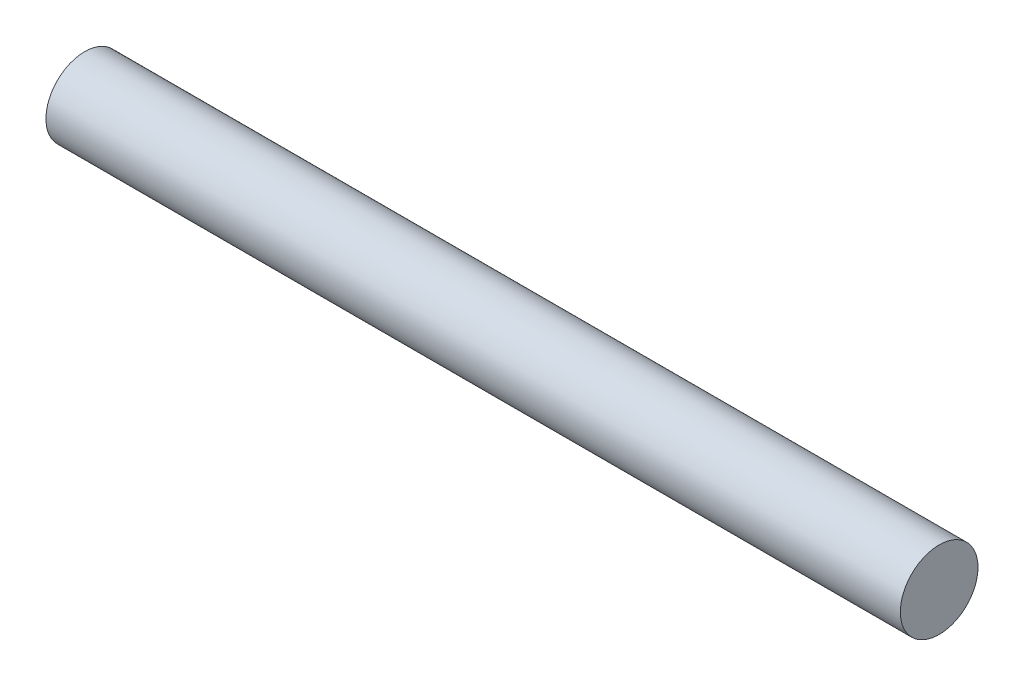
ISO-10303-21;
HEADER;
FILE_DESCRIPTION(('STEP AP214'),'2;1');
FILE_NAME('part.step','',(''),(''),'','','');
FILE_SCHEMA(('AUTOMOTIVE_DESIGN { 1 0 10303 214 1 1 1 1 }'));
ENDSEC;
DATA;
#1=APPLICATION_CONTEXT('core data for automotive mechanical design processes');
#2=APPLICATION_PROTOCOL_DEFINITION('international standard','automotive_design',2000,#1);
#3=PRODUCT_CONTEXT('',#1,'mechanical');
#4=PRODUCT('Part','Part','',(#3));
#5=PRODUCT_RELATED_PRODUCT_CATEGORY('part','',(#4));
#6=PRODUCT_DEFINITION_FORMATION('','',#4);
#7=PRODUCT_DEFINITION_CONTEXT('part definition',#1,'design');
#8=PRODUCT_DEFINITION('design','',#6,#7);
#9=PRODUCT_DEFINITION_SHAPE('','',#8);
#10=(LENGTH_UNIT() NAMED_UNIT(*) SI_UNIT(.MILLI.,.METRE.));
#11=(NAMED_UNIT(*) PLANE_ANGLE_UNIT() SI_UNIT($,.RADIAN.));
#12=(NAMED_UNIT(*) SI_UNIT($,.STERADIAN.) SOLID_ANGLE_UNIT());
#13=UNCERTAINTY_MEASURE_WITH_UNIT(LENGTH_MEASURE(1.E-05),#10,'distance_accuracy_value','');
#14=(GEOMETRIC_REPRESENTATION_CONTEXT(3) GLOBAL_UNCERTAINTY_ASSIGNED_CONTEXT((#13)) GLOBAL_UNIT_ASSIGNED_CONTEXT((#10,
#11,#12)) REPRESENTATION_CONTEXT('',''));
#15=CARTESIAN_POINT('',(0.,0.,0.));
#16=DIRECTION('',(0.,0.,1.));
#17=DIRECTION('',(1.,0.,0.));
#18=AXIS2_PLACEMENT_3D('',#15,#16,#17);
#19=CARTESIAN_POINT('',(69.85,0.,0.));
#20=DIRECTION('',(-1.,0.,0.));
#21=DIRECTION('',(0.,0.,1.));
#22=AXIS2_PLACEMENT_3D('',#19,#20,#21);
#23=CYLINDRICAL_SURFACE('',#22,3.175);
#24=CARTESIAN_POINT('',(69.85,0.,0.));
#25=DIRECTION('',(1.,0.,0.));
#26=DIRECTION('',(0.,0.,-1.));
#27=AXIS2_PLACEMENT_3D('',#24,#25,#26);
#28=CIRCLE('',#27,3.175);
#29=CARTESIAN_POINT('',(69.85,0.,-3.175));
#30=VERTEX_POINT('',#29);
#31=EDGE_CURVE('E10',#30,#30,#28,.T.);
#32=ORIENTED_EDGE('',*,*,#31,.F.);
#33=EDGE_LOOP('',(#32));
#34=FACE_BOUND('',#33,.T.);
#35=CARTESIAN_POINT('',(0.,0.,0.));
#36=DIRECTION('',(1.,0.,0.));
#37=DIRECTION('',(0.,0.,-1.));
#38=AXIS2_PLACEMENT_3D('',#35,#36,#37);
#39=CIRCLE('',#38,3.175);
#40=CARTESIAN_POINT('',(0.,0.,-3.175));
#41=VERTEX_POINT('',#40);
#42=EDGE_CURVE('E34',#41,#41,#39,.T.);
#43=ORIENTED_EDGE('',*,*,#42,.T.);
#44=EDGE_LOOP('',(#43));
#45=FACE_BOUND('',#44,.T.);
#46=ADVANCED_FACE('F31',(#34,#45),#23,.T.);
#47=CARTESIAN_POINT('',(69.85,0.,0.));
#48=DIRECTION('',(1.,0.,0.));
#49=DIRECTION('',(0.,0.,-1.));
#50=AXIS2_PLACEMENT_3D('',#47,#48,#49);
#51=PLANE('',#50);
#52=ORIENTED_EDGE('',*,*,#31,.T.);
#53=EDGE_LOOP('',(#52));
#54=FACE_BOUND('',#53,.T.);
#55=ADVANCED_FACE('F46',(#54),#51,.T.);
#56=CARTESIAN_POINT('',(0.,0.,0.));
#57=DIRECTION('',(1.,0.,0.));
#58=DIRECTION('',(0.,0.,-1.));
#59=AXIS2_PLACEMENT_3D('',#56,#57,#58);
#60=PLANE('',#59);
#61=ORIENTED_EDGE('',*,*,#42,.F.);
#62=EDGE_LOOP('',(#61));
#63=FACE_BOUND('',#62,.T.);
#64=ADVANCED_FACE('F44',(#63),#60,.F.);
#65=CLOSED_SHELL('',(#46,#55,#64));
#66=MANIFOLD_SOLID_BREP('B2',#65);
#67=ADVANCED_BREP_SHAPE_REPRESENTATION('',(#18,#66),#14);
#68=SHAPE_DEFINITION_REPRESENTATION(#9,#67);
ENDSEC;
END-ISO-10303-21;
